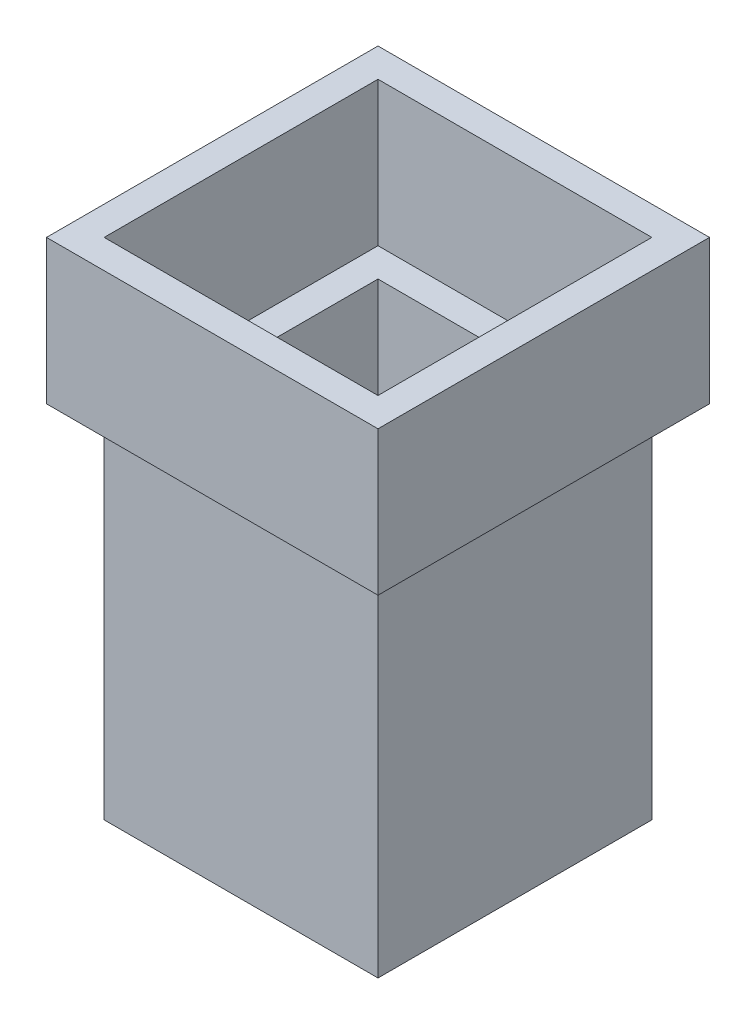
ISO-10303-21;
HEADER;
FILE_DESCRIPTION(('STEP AP214'),'2;1');
FILE_NAME('part.step','',(''),(''),'','','');
FILE_SCHEMA(('AUTOMOTIVE_DESIGN { 1 0 10303 214 1 1 1 1 }'));
ENDSEC;
DATA;
#1=APPLICATION_CONTEXT('core data for automotive mechanical design processes');
#2=APPLICATION_PROTOCOL_DEFINITION('international standard','automotive_design',2000,#1);
#3=PRODUCT_CONTEXT('',#1,'mechanical');
#4=PRODUCT('Part','Part','',(#3));
#5=PRODUCT_RELATED_PRODUCT_CATEGORY('part','',(#4));
#6=PRODUCT_DEFINITION_FORMATION('','',#4);
#7=PRODUCT_DEFINITION_CONTEXT('part definition',#1,'design');
#8=PRODUCT_DEFINITION('design','',#6,#7);
#9=PRODUCT_DEFINITION_SHAPE('','',#8);
#10=(LENGTH_UNIT() NAMED_UNIT(*) SI_UNIT(.MILLI.,.METRE.));
#11=(NAMED_UNIT(*) PLANE_ANGLE_UNIT() SI_UNIT($,.RADIAN.));
#12=(NAMED_UNIT(*) SI_UNIT($,.STERADIAN.) SOLID_ANGLE_UNIT());
#13=UNCERTAINTY_MEASURE_WITH_UNIT(LENGTH_MEASURE(1.E-05),#10,'distance_accuracy_value','');
#14=(GEOMETRIC_REPRESENTATION_CONTEXT(3) GLOBAL_UNCERTAINTY_ASSIGNED_CONTEXT((#13)) GLOBAL_UNIT_ASSIGNED_CONTEXT((#10,
#11,#12)) REPRESENTATION_CONTEXT('',''));
#15=CARTESIAN_POINT('',(0.,0.,0.));
#16=DIRECTION('',(0.,0.,1.));
#17=DIRECTION('',(1.,0.,0.));
#18=AXIS2_PLACEMENT_3D('',#15,#16,#17);
#19=CARTESIAN_POINT('',(0.,35.,0.));
#20=DIRECTION('',(0.,-1.,0.));
#21=DIRECTION('',(0.,0.,-1.));
#22=AXIS2_PLACEMENT_3D('',#19,#20,#21);
#23=PLANE('',#22);
#24=DIRECTION('',(0.,0.,1.));
#25=VECTOR('',#24,1.);
#26=CARTESIAN_POINT('',(-11.5,35.,-11.5));
#27=LINE('',#26,#25);
#28=CARTESIAN_POINT('',(-11.5,35.,-11.5));
#29=VERTEX_POINT('',#28);
#30=CARTESIAN_POINT('',(-11.5,35.,11.5));
#31=VERTEX_POINT('',#30);
#32=EDGE_CURVE('E150',#29,#31,#27,.T.);
#33=ORIENTED_EDGE('',*,*,#32,.T.);
#34=DIRECTION('',(1.,0.,0.));
#35=VECTOR('',#34,1.);
#36=CARTESIAN_POINT('',(11.5,35.,11.5));
#37=LINE('',#36,#35);
#38=CARTESIAN_POINT('',(11.5,35.,11.5));
#39=VERTEX_POINT('',#38);
#40=EDGE_CURVE('E153',#31,#39,#37,.T.);
#41=ORIENTED_EDGE('',*,*,#40,.T.);
#42=DIRECTION('',(0.,0.,-1.));
#43=VECTOR('',#42,1.);
#44=CARTESIAN_POINT('',(11.5,35.,-11.5));
#45=LINE('',#44,#43);
#46=CARTESIAN_POINT('',(11.5,35.,-11.5));
#47=VERTEX_POINT('',#46);
#48=EDGE_CURVE('E156',#39,#47,#45,.T.);
#49=ORIENTED_EDGE('',*,*,#48,.T.);
#50=DIRECTION('',(-1.,0.,0.));
#51=VECTOR('',#50,1.);
#52=CARTESIAN_POINT('',(11.5,35.,-11.5));
#53=LINE('',#52,#51);
#54=EDGE_CURVE('E158',#47,#29,#53,.T.);
#55=ORIENTED_EDGE('',*,*,#54,.T.);
#56=EDGE_LOOP('',(#33,#41,#49,#55));
#57=FACE_BOUND('',#56,.T.);
#58=DIRECTION('',(0.,0.,1.));
#59=VECTOR('',#58,1.);
#60=CARTESIAN_POINT('',(-9.5,35.,-9.5));
#61=LINE('',#60,#59);
#62=CARTESIAN_POINT('',(-9.5,35.,-9.5));
#63=VERTEX_POINT('',#62);
#64=CARTESIAN_POINT('',(-9.5,35.,9.5));
#65=VERTEX_POINT('',#64);
#66=EDGE_CURVE('E114',#63,#65,#61,.T.);
#67=ORIENTED_EDGE('',*,*,#66,.F.);
#68=DIRECTION('',(-1.,0.,0.));
#69=VECTOR('',#68,1.);
#70=CARTESIAN_POINT('',(-9.5,35.,-9.5));
#71=LINE('',#70,#69);
#72=CARTESIAN_POINT('',(9.5,35.,-9.5));
#73=VERTEX_POINT('',#72);
#74=EDGE_CURVE('E136',#73,#63,#71,.T.);
#75=ORIENTED_EDGE('',*,*,#74,.F.);
#76=DIRECTION('',(0.,0.,-1.));
#77=VECTOR('',#76,1.);
#78=CARTESIAN_POINT('',(9.5,35.,-9.5));
#79=LINE('',#78,#77);
#80=CARTESIAN_POINT('',(9.5,35.,9.5));
#81=VERTEX_POINT('',#80);
#82=EDGE_CURVE('E134',#81,#73,#79,.T.);
#83=ORIENTED_EDGE('',*,*,#82,.F.);
#84=DIRECTION('',(1.,0.,0.));
#85=VECTOR('',#84,1.);
#86=CARTESIAN_POINT('',(-9.5,35.,9.5));
#87=LINE('',#86,#85);
#88=EDGE_CURVE('E122',#65,#81,#87,.T.);
#89=ORIENTED_EDGE('',*,*,#88,.F.);
#90=EDGE_LOOP('',(#67,#75,#83,#89));
#91=FACE_BOUND('',#90,.T.);
#92=ADVANCED_FACE('F49',(#57,#91),#23,.F.);
#93=CARTESIAN_POINT('',(0.,25.,0.));
#94=DIRECTION('',(0.,-1.,0.));
#95=DIRECTION('',(0.,0.,-1.));
#96=AXIS2_PLACEMENT_3D('',#93,#94,#95);
#97=PLANE('',#96);
#98=DIRECTION('',(0.,0.,1.));
#99=VECTOR('',#98,1.);
#100=CARTESIAN_POINT('',(-11.5,25.,-11.5));
#101=LINE('',#100,#99);
#102=CARTESIAN_POINT('',(-11.5,25.,-11.5));
#103=VERTEX_POINT('',#102);
#104=CARTESIAN_POINT('',(-11.5,25.,11.5));
#105=VERTEX_POINT('',#104);
#106=EDGE_CURVE('E130',#103,#105,#101,.T.);
#107=ORIENTED_EDGE('',*,*,#106,.F.);
#108=DIRECTION('',(-1.,0.,0.));
#109=VECTOR('',#108,1.);
#110=CARTESIAN_POINT('',(11.5,25.,-11.5));
#111=LINE('',#110,#109);
#112=CARTESIAN_POINT('',(11.5,25.,-11.5));
#113=VERTEX_POINT('',#112);
#114=EDGE_CURVE('E154',#113,#103,#111,.T.);
#115=ORIENTED_EDGE('',*,*,#114,.F.);
#116=DIRECTION('',(0.,0.,-1.));
#117=VECTOR('',#116,1.);
#118=CARTESIAN_POINT('',(11.5,25.,-11.5));
#119=LINE('',#118,#117);
#120=CARTESIAN_POINT('',(11.5,25.,11.5));
#121=VERTEX_POINT('',#120);
#122=EDGE_CURVE('E165',#121,#113,#119,.T.);
#123=ORIENTED_EDGE('',*,*,#122,.F.);
#124=DIRECTION('',(1.,0.,0.));
#125=VECTOR('',#124,1.);
#126=CARTESIAN_POINT('',(11.5,25.,11.5));
#127=LINE('',#126,#125);
#128=EDGE_CURVE('E163',#105,#121,#127,.T.);
#129=ORIENTED_EDGE('',*,*,#128,.F.);
#130=EDGE_LOOP('',(#107,#115,#123,#129));
#131=FACE_BOUND('',#130,.T.);
#132=DIRECTION('',(-1.,0.,0.));
#133=VECTOR('',#132,1.);
#134=CARTESIAN_POINT('',(-9.5,25.,-9.5));
#135=LINE('',#134,#133);
#136=CARTESIAN_POINT('',(9.5,25.,-9.5));
#137=VERTEX_POINT('',#136);
#138=CARTESIAN_POINT('',(-9.5,25.,-9.5));
#139=VERTEX_POINT('',#138);
#140=EDGE_CURVE('E123',#137,#139,#135,.T.);
#141=ORIENTED_EDGE('',*,*,#140,.T.);
#142=DIRECTION('',(0.,0.,1.));
#143=VECTOR('',#142,1.);
#144=CARTESIAN_POINT('',(-9.5,25.,-9.5));
#145=LINE('',#144,#143);
#146=CARTESIAN_POINT('',(-9.5,25.,9.5));
#147=VERTEX_POINT('',#146);
#148=EDGE_CURVE('E72',#139,#147,#145,.T.);
#149=ORIENTED_EDGE('',*,*,#148,.T.);
#150=DIRECTION('',(1.,0.,0.));
#151=VECTOR('',#150,1.);
#152=CARTESIAN_POINT('',(-9.5,25.,9.5));
#153=LINE('',#152,#151);
#154=CARTESIAN_POINT('',(9.5,25.,9.5));
#155=VERTEX_POINT('',#154);
#156=EDGE_CURVE('E129',#147,#155,#153,.T.);
#157=ORIENTED_EDGE('',*,*,#156,.T.);
#158=DIRECTION('',(0.,0.,-1.));
#159=VECTOR('',#158,1.);
#160=CARTESIAN_POINT('',(9.5,25.,-9.5));
#161=LINE('',#160,#159);
#162=EDGE_CURVE('E142',#155,#137,#161,.T.);
#163=ORIENTED_EDGE('',*,*,#162,.T.);
#164=EDGE_LOOP('',(#141,#149,#157,#163));
#165=FACE_BOUND('',#164,.T.);
#166=ADVANCED_FACE('F183',(#131,#165),#97,.T.);
#167=CARTESIAN_POINT('',(-11.5,35.,-11.5));
#168=DIRECTION('',(1.,0.,0.));
#169=DIRECTION('',(0.,0.,-1.));
#170=AXIS2_PLACEMENT_3D('',#167,#168,#169);
#171=PLANE('',#170);
#172=ORIENTED_EDGE('',*,*,#106,.T.);
#173=DIRECTION('',(0.,-1.,0.));
#174=VECTOR('',#173,1.);
#175=CARTESIAN_POINT('',(-11.5,35.,11.5));
#176=LINE('',#175,#174);
#177=EDGE_CURVE('E12',#31,#105,#176,.T.);
#178=ORIENTED_EDGE('',*,*,#177,.F.);
#179=ORIENTED_EDGE('',*,*,#32,.F.);
#180=DIRECTION('',(0.,-1.,0.));
#181=VECTOR('',#180,1.);
#182=CARTESIAN_POINT('',(-11.5,35.,-11.5));
#183=LINE('',#182,#181);
#184=EDGE_CURVE('E160',#29,#103,#183,.T.);
#185=ORIENTED_EDGE('',*,*,#184,.T.);
#186=EDGE_LOOP('',(#172,#178,#179,#185));
#187=FACE_BOUND('',#186,.T.);
#188=ADVANCED_FACE('F51',(#187),#171,.F.);
#189=CARTESIAN_POINT('',(11.5,35.,11.5));
#190=DIRECTION('',(0.,0.,-1.));
#191=DIRECTION('',(-1.,0.,0.));
#192=AXIS2_PLACEMENT_3D('',#189,#190,#191);
#193=PLANE('',#192);
#194=ORIENTED_EDGE('',*,*,#128,.T.);
#195=DIRECTION('',(0.,-1.,0.));
#196=VECTOR('',#195,1.);
#197=CARTESIAN_POINT('',(11.5,35.,11.5));
#198=LINE('',#197,#196);
#199=EDGE_CURVE('E57',#39,#121,#198,.T.);
#200=ORIENTED_EDGE('',*,*,#199,.F.);
#201=ORIENTED_EDGE('',*,*,#40,.F.);
#202=ORIENTED_EDGE('',*,*,#177,.T.);
#203=EDGE_LOOP('',(#194,#200,#201,#202));
#204=FACE_BOUND('',#203,.T.);
#205=ADVANCED_FACE('F193',(#204),#193,.F.);
#206=CARTESIAN_POINT('',(11.5,35.,-11.5));
#207=DIRECTION('',(-1.,0.,0.));
#208=DIRECTION('',(0.,0.,1.));
#209=AXIS2_PLACEMENT_3D('',#206,#207,#208);
#210=PLANE('',#209);
#211=ORIENTED_EDGE('',*,*,#122,.T.);
#212=DIRECTION('',(0.,-1.,0.));
#213=VECTOR('',#212,1.);
#214=CARTESIAN_POINT('',(11.5,35.,-11.5));
#215=LINE('',#214,#213);
#216=EDGE_CURVE('E170',#47,#113,#215,.T.);
#217=ORIENTED_EDGE('',*,*,#216,.F.);
#218=ORIENTED_EDGE('',*,*,#48,.F.);
#219=ORIENTED_EDGE('',*,*,#199,.T.);
#220=EDGE_LOOP('',(#211,#217,#218,#219));
#221=FACE_BOUND('',#220,.T.);
#222=ADVANCED_FACE('F177',(#221),#210,.F.);
#223=CARTESIAN_POINT('',(11.5,35.,-11.5));
#224=DIRECTION('',(0.,0.,1.));
#225=DIRECTION('',(1.,0.,0.));
#226=AXIS2_PLACEMENT_3D('',#223,#224,#225);
#227=PLANE('',#226);
#228=ORIENTED_EDGE('',*,*,#114,.T.);
#229=ORIENTED_EDGE('',*,*,#184,.F.);
#230=ORIENTED_EDGE('',*,*,#54,.F.);
#231=ORIENTED_EDGE('',*,*,#216,.T.);
#232=EDGE_LOOP('',(#228,#229,#230,#231));
#233=FACE_BOUND('',#232,.T.);
#234=ADVANCED_FACE('F187',(#233),#227,.F.);
#235=CARTESIAN_POINT('',(-9.5,35.,-9.5));
#236=DIRECTION('',(1.,0.,0.));
#237=DIRECTION('',(0.,0.,-1.));
#238=AXIS2_PLACEMENT_3D('',#235,#236,#237);
#239=PLANE('',#238);
#240=ORIENTED_EDGE('',*,*,#148,.F.);
#241=DIRECTION('',(0.,-1.,0.));
#242=VECTOR('',#241,1.);
#243=CARTESIAN_POINT('',(-9.5,35.,-9.5));
#244=LINE('',#243,#242);
#245=EDGE_CURVE('E118',#63,#139,#244,.T.);
#246=ORIENTED_EDGE('',*,*,#245,.F.);
#247=ORIENTED_EDGE('',*,*,#66,.T.);
#248=DIRECTION('',(0.,-1.,0.));
#249=VECTOR('',#248,1.);
#250=CARTESIAN_POINT('',(-9.5,35.,9.5));
#251=LINE('',#250,#249);
#252=EDGE_CURVE('E117',#65,#147,#251,.T.);
#253=ORIENTED_EDGE('',*,*,#252,.T.);
#254=EDGE_LOOP('',(#240,#246,#247,#253));
#255=FACE_BOUND('',#254,.T.);
#256=ADVANCED_FACE('F116',(#255),#239,.T.);
#257=CARTESIAN_POINT('',(-9.5,35.,9.5));
#258=DIRECTION('',(0.,0.,-1.));
#259=DIRECTION('',(-1.,0.,0.));
#260=AXIS2_PLACEMENT_3D('',#257,#258,#259);
#261=PLANE('',#260);
#262=ORIENTED_EDGE('',*,*,#156,.F.);
#263=ORIENTED_EDGE('',*,*,#252,.F.);
#264=ORIENTED_EDGE('',*,*,#88,.T.);
#265=DIRECTION('',(0.,-1.,0.));
#266=VECTOR('',#265,1.);
#267=CARTESIAN_POINT('',(9.5,35.,9.5));
#268=LINE('',#267,#266);
#269=EDGE_CURVE('E131',#81,#155,#268,.T.);
#270=ORIENTED_EDGE('',*,*,#269,.T.);
#271=EDGE_LOOP('',(#262,#263,#264,#270));
#272=FACE_BOUND('',#271,.T.);
#273=ADVANCED_FACE('F126',(#272),#261,.T.);
#274=CARTESIAN_POINT('',(9.5,35.,-9.5));
#275=DIRECTION('',(-1.,0.,0.));
#276=DIRECTION('',(0.,0.,1.));
#277=AXIS2_PLACEMENT_3D('',#274,#275,#276);
#278=PLANE('',#277);
#279=ORIENTED_EDGE('',*,*,#162,.F.);
#280=ORIENTED_EDGE('',*,*,#269,.F.);
#281=ORIENTED_EDGE('',*,*,#82,.T.);
#282=DIRECTION('',(0.,-1.,0.));
#283=VECTOR('',#282,1.);
#284=CARTESIAN_POINT('',(9.5,35.,-9.5));
#285=LINE('',#284,#283);
#286=EDGE_CURVE('E64',#73,#137,#285,.T.);
#287=ORIENTED_EDGE('',*,*,#286,.T.);
#288=EDGE_LOOP('',(#279,#280,#281,#287));
#289=FACE_BOUND('',#288,.T.);
#290=ADVANCED_FACE('F216',(#289),#278,.T.);
#291=CARTESIAN_POINT('',(-9.5,35.,-9.5));
#292=DIRECTION('',(0.,0.,1.));
#293=DIRECTION('',(1.,0.,0.));
#294=AXIS2_PLACEMENT_3D('',#291,#292,#293);
#295=PLANE('',#294);
#296=ORIENTED_EDGE('',*,*,#140,.F.);
#297=ORIENTED_EDGE('',*,*,#286,.F.);
#298=ORIENTED_EDGE('',*,*,#74,.T.);
#299=ORIENTED_EDGE('',*,*,#245,.T.);
#300=EDGE_LOOP('',(#296,#297,#298,#299));
#301=FACE_BOUND('',#300,.T.);
#302=ADVANCED_FACE('F220',(#301),#295,.T.);
#303=CLOSED_SHELL('',(#92,#166,#188,#205,#222,#234,#256,#273,#290,#302));
#304=MANIFOLD_SOLID_BREP('B2',#303);
#305=CARTESIAN_POINT('',(0.,25.,0.));
#306=DIRECTION('',(0.,-1.,0.));
#307=DIRECTION('',(0.,0.,-1.));
#308=AXIS2_PLACEMENT_3D('',#305,#306,#307);
#309=PLANE('',#308);
#310=DIRECTION('',(0.,0.,1.));
#311=VECTOR('',#310,1.);
#312=CARTESIAN_POINT('',(-9.5,25.,-9.5));
#313=LINE('',#312,#311);
#314=CARTESIAN_POINT('',(-9.5,25.,-9.5));
#315=VERTEX_POINT('',#314);
#316=CARTESIAN_POINT('',(-9.5,25.,9.5));
#317=VERTEX_POINT('',#316);
#318=EDGE_CURVE('E400',#315,#317,#313,.T.);
#319=ORIENTED_EDGE('',*,*,#318,.T.);
#320=DIRECTION('',(1.,0.,0.));
#321=VECTOR('',#320,1.);
#322=CARTESIAN_POINT('',(9.5,25.,9.5));
#323=LINE('',#322,#321);
#324=CARTESIAN_POINT('',(9.5,25.,9.5));
#325=VERTEX_POINT('',#324);
#326=EDGE_CURVE('E403',#317,#325,#323,.T.);
#327=ORIENTED_EDGE('',*,*,#326,.T.);
#328=DIRECTION('',(0.,0.,-1.));
#329=VECTOR('',#328,1.);
#330=CARTESIAN_POINT('',(9.5,25.,-9.5));
#331=LINE('',#330,#329);
#332=CARTESIAN_POINT('',(9.5,25.,-9.5));
#333=VERTEX_POINT('',#332);
#334=EDGE_CURVE('E406',#325,#333,#331,.T.);
#335=ORIENTED_EDGE('',*,*,#334,.T.);
#336=DIRECTION('',(-1.,0.,0.));
#337=VECTOR('',#336,1.);
#338=CARTESIAN_POINT('',(9.5,25.,-9.5));
#339=LINE('',#338,#337);
#340=EDGE_CURVE('E408',#333,#315,#339,.T.);
#341=ORIENTED_EDGE('',*,*,#340,.T.);
#342=EDGE_LOOP('',(#319,#327,#335,#341));
#343=FACE_BOUND('',#342,.T.);
#344=DIRECTION('',(0.,0.,1.));
#345=VECTOR('',#344,1.);
#346=CARTESIAN_POINT('',(-7.5,25.,-7.5));
#347=LINE('',#346,#345);
#348=CARTESIAN_POINT('',(-7.5,25.,-7.5));
#349=VERTEX_POINT('',#348);
#350=CARTESIAN_POINT('',(-7.5,25.,7.5));
#351=VERTEX_POINT('',#350);
#352=EDGE_CURVE('E364',#349,#351,#347,.T.);
#353=ORIENTED_EDGE('',*,*,#352,.F.);
#354=DIRECTION('',(-1.,0.,0.));
#355=VECTOR('',#354,1.);
#356=CARTESIAN_POINT('',(7.5,25.,-7.5));
#357=LINE('',#356,#355);
#358=CARTESIAN_POINT('',(7.5,25.,-7.5));
#359=VERTEX_POINT('',#358);
#360=EDGE_CURVE('E386',#359,#349,#357,.T.);
#361=ORIENTED_EDGE('',*,*,#360,.F.);
#362=DIRECTION('',(0.,0.,-1.));
#363=VECTOR('',#362,1.);
#364=CARTESIAN_POINT('',(7.5,25.,-7.5));
#365=LINE('',#364,#363);
#366=CARTESIAN_POINT('',(7.5,25.,7.5));
#367=VERTEX_POINT('',#366);
#368=EDGE_CURVE('E384',#367,#359,#365,.T.);
#369=ORIENTED_EDGE('',*,*,#368,.F.);
#370=DIRECTION('',(1.,0.,0.));
#371=VECTOR('',#370,1.);
#372=CARTESIAN_POINT('',(7.5,25.,7.5));
#373=LINE('',#372,#371);
#374=EDGE_CURVE('E372',#351,#367,#373,.T.);
#375=ORIENTED_EDGE('',*,*,#374,.F.);
#376=EDGE_LOOP('',(#353,#361,#369,#375));
#377=FACE_BOUND('',#376,.T.);
#378=ADVANCED_FACE('F299',(#343,#377),#309,.F.);
#379=CARTESIAN_POINT('',(0.,0.,0.));
#380=DIRECTION('',(0.,-1.,0.));
#381=DIRECTION('',(0.,0.,-1.));
#382=AXIS2_PLACEMENT_3D('',#379,#380,#381);
#383=PLANE('',#382);
#384=DIRECTION('',(0.,0.,1.));
#385=VECTOR('',#384,1.);
#386=CARTESIAN_POINT('',(-9.5,0.,-9.5));
#387=LINE('',#386,#385);
#388=CARTESIAN_POINT('',(-9.5,0.,-9.5));
#389=VERTEX_POINT('',#388);
#390=CARTESIAN_POINT('',(-9.5,0.,9.5));
#391=VERTEX_POINT('',#390);
#392=EDGE_CURVE('E380',#389,#391,#387,.T.);
#393=ORIENTED_EDGE('',*,*,#392,.F.);
#394=DIRECTION('',(-1.,0.,0.));
#395=VECTOR('',#394,1.);
#396=CARTESIAN_POINT('',(9.5,0.,-9.5));
#397=LINE('',#396,#395);
#398=CARTESIAN_POINT('',(9.5,0.,-9.5));
#399=VERTEX_POINT('',#398);
#400=EDGE_CURVE('E404',#399,#389,#397,.T.);
#401=ORIENTED_EDGE('',*,*,#400,.F.);
#402=DIRECTION('',(0.,0.,-1.));
#403=VECTOR('',#402,1.);
#404=CARTESIAN_POINT('',(9.5,0.,-9.5));
#405=LINE('',#404,#403);
#406=CARTESIAN_POINT('',(9.5,0.,9.5));
#407=VERTEX_POINT('',#406);
#408=EDGE_CURVE('E415',#407,#399,#405,.T.);
#409=ORIENTED_EDGE('',*,*,#408,.F.);
#410=DIRECTION('',(1.,0.,0.));
#411=VECTOR('',#410,1.);
#412=CARTESIAN_POINT('',(9.5,0.,9.5));
#413=LINE('',#412,#411);
#414=EDGE_CURVE('E413',#391,#407,#413,.T.);
#415=ORIENTED_EDGE('',*,*,#414,.F.);
#416=EDGE_LOOP('',(#393,#401,#409,#415));
#417=FACE_BOUND('',#416,.T.);
#418=DIRECTION('',(-1.,0.,0.));
#419=VECTOR('',#418,1.);
#420=CARTESIAN_POINT('',(7.5,0.,-7.5));
#421=LINE('',#420,#419);
#422=CARTESIAN_POINT('',(7.5,0.,-7.5));
#423=VERTEX_POINT('',#422);
#424=CARTESIAN_POINT('',(-7.5,0.,-7.5));
#425=VERTEX_POINT('',#424);
#426=EDGE_CURVE('E373',#423,#425,#421,.T.);
#427=ORIENTED_EDGE('',*,*,#426,.T.);
#428=DIRECTION('',(0.,0.,1.));
#429=VECTOR('',#428,1.);
#430=CARTESIAN_POINT('',(-7.5,0.,-7.5));
#431=LINE('',#430,#429);
#432=CARTESIAN_POINT('',(-7.5,0.,7.5));
#433=VERTEX_POINT('',#432);
#434=EDGE_CURVE('E322',#425,#433,#431,.T.);
#435=ORIENTED_EDGE('',*,*,#434,.T.);
#436=DIRECTION('',(1.,0.,0.));
#437=VECTOR('',#436,1.);
#438=CARTESIAN_POINT('',(7.5,0.,7.5));
#439=LINE('',#438,#437);
#440=CARTESIAN_POINT('',(7.5,0.,7.5));
#441=VERTEX_POINT('',#440);
#442=EDGE_CURVE('E379',#433,#441,#439,.T.);
#443=ORIENTED_EDGE('',*,*,#442,.T.);
#444=DIRECTION('',(0.,0.,-1.));
#445=VECTOR('',#444,1.);
#446=CARTESIAN_POINT('',(7.5,0.,-7.5));
#447=LINE('',#446,#445);
#448=EDGE_CURVE('E392',#441,#423,#447,.T.);
#449=ORIENTED_EDGE('',*,*,#448,.T.);
#450=EDGE_LOOP('',(#427,#435,#443,#449));
#451=FACE_BOUND('',#450,.T.);
#452=ADVANCED_FACE('F433',(#417,#451),#383,.T.);
#453=CARTESIAN_POINT('',(-9.5,25.,-9.5));
#454=DIRECTION('',(1.,0.,0.));
#455=DIRECTION('',(0.,0.,-1.));
#456=AXIS2_PLACEMENT_3D('',#453,#454,#455);
#457=PLANE('',#456);
#458=ORIENTED_EDGE('',*,*,#392,.T.);
#459=DIRECTION('',(0.,-1.,0.));
#460=VECTOR('',#459,1.);
#461=CARTESIAN_POINT('',(-9.5,25.,9.5));
#462=LINE('',#461,#460);
#463=EDGE_CURVE('E47',#317,#391,#462,.T.);
#464=ORIENTED_EDGE('',*,*,#463,.F.);
#465=ORIENTED_EDGE('',*,*,#318,.F.);
#466=DIRECTION('',(0.,-1.,0.));
#467=VECTOR('',#466,1.);
#468=CARTESIAN_POINT('',(-9.5,25.,-9.5));
#469=LINE('',#468,#467);
#470=EDGE_CURVE('E410',#315,#389,#469,.T.);
#471=ORIENTED_EDGE('',*,*,#470,.T.);
#472=EDGE_LOOP('',(#458,#464,#465,#471));
#473=FACE_BOUND('',#472,.T.);
#474=ADVANCED_FACE('F301',(#473),#457,.F.);
#475=CARTESIAN_POINT('',(9.5,25.,9.5));
#476=DIRECTION('',(0.,0.,-1.));
#477=DIRECTION('',(-1.,0.,0.));
#478=AXIS2_PLACEMENT_3D('',#475,#476,#477);
#479=PLANE('',#478);
#480=ORIENTED_EDGE('',*,*,#414,.T.);
#481=DIRECTION('',(0.,-1.,0.));
#482=VECTOR('',#481,1.);
#483=CARTESIAN_POINT('',(9.5,25.,9.5));
#484=LINE('',#483,#482);
#485=EDGE_CURVE('E307',#325,#407,#484,.T.);
#486=ORIENTED_EDGE('',*,*,#485,.F.);
#487=ORIENTED_EDGE('',*,*,#326,.F.);
#488=ORIENTED_EDGE('',*,*,#463,.T.);
#489=EDGE_LOOP('',(#480,#486,#487,#488));
#490=FACE_BOUND('',#489,.T.);
#491=ADVANCED_FACE('F443',(#490),#479,.F.);
#492=CARTESIAN_POINT('',(9.5,25.,-9.5));
#493=DIRECTION('',(-1.,0.,0.));
#494=DIRECTION('',(0.,0.,1.));
#495=AXIS2_PLACEMENT_3D('',#492,#493,#494);
#496=PLANE('',#495);
#497=ORIENTED_EDGE('',*,*,#408,.T.);
#498=DIRECTION('',(0.,-1.,0.));
#499=VECTOR('',#498,1.);
#500=CARTESIAN_POINT('',(9.5,25.,-9.5));
#501=LINE('',#500,#499);
#502=EDGE_CURVE('E420',#333,#399,#501,.T.);
#503=ORIENTED_EDGE('',*,*,#502,.F.);
#504=ORIENTED_EDGE('',*,*,#334,.F.);
#505=ORIENTED_EDGE('',*,*,#485,.T.);
#506=EDGE_LOOP('',(#497,#503,#504,#505));
#507=FACE_BOUND('',#506,.T.);
#508=ADVANCED_FACE('F427',(#507),#496,.F.);
#509=CARTESIAN_POINT('',(9.5,25.,-9.5));
#510=DIRECTION('',(0.,0.,1.));
#511=DIRECTION('',(1.,0.,0.));
#512=AXIS2_PLACEMENT_3D('',#509,#510,#511);
#513=PLANE('',#512);
#514=ORIENTED_EDGE('',*,*,#400,.T.);
#515=ORIENTED_EDGE('',*,*,#470,.F.);
#516=ORIENTED_EDGE('',*,*,#340,.F.);
#517=ORIENTED_EDGE('',*,*,#502,.T.);
#518=EDGE_LOOP('',(#514,#515,#516,#517));
#519=FACE_BOUND('',#518,.T.);
#520=ADVANCED_FACE('F437',(#519),#513,.F.);
#521=CARTESIAN_POINT('',(-7.5,25.,-7.5));
#522=DIRECTION('',(1.,0.,0.));
#523=DIRECTION('',(0.,0.,-1.));
#524=AXIS2_PLACEMENT_3D('',#521,#522,#523);
#525=PLANE('',#524);
#526=ORIENTED_EDGE('',*,*,#434,.F.);
#527=DIRECTION('',(0.,-1.,0.));
#528=VECTOR('',#527,1.);
#529=CARTESIAN_POINT('',(-7.5,25.,-7.5));
#530=LINE('',#529,#528);
#531=EDGE_CURVE('E368',#349,#425,#530,.T.);
#532=ORIENTED_EDGE('',*,*,#531,.F.);
#533=ORIENTED_EDGE('',*,*,#352,.T.);
#534=DIRECTION('',(0.,-1.,0.));
#535=VECTOR('',#534,1.);
#536=CARTESIAN_POINT('',(-7.5,25.,7.5));
#537=LINE('',#536,#535);
#538=EDGE_CURVE('E367',#351,#433,#537,.T.);
#539=ORIENTED_EDGE('',*,*,#538,.T.);
#540=EDGE_LOOP('',(#526,#532,#533,#539));
#541=FACE_BOUND('',#540,.T.);
#542=ADVANCED_FACE('F366',(#541),#525,.T.);
#543=CARTESIAN_POINT('',(7.5,25.,7.5));
#544=DIRECTION('',(0.,0.,-1.));
#545=DIRECTION('',(-1.,0.,0.));
#546=AXIS2_PLACEMENT_3D('',#543,#544,#545);
#547=PLANE('',#546);
#548=ORIENTED_EDGE('',*,*,#442,.F.);
#549=ORIENTED_EDGE('',*,*,#538,.F.);
#550=ORIENTED_EDGE('',*,*,#374,.T.);
#551=DIRECTION('',(0.,-1.,0.));
#552=VECTOR('',#551,1.);
#553=CARTESIAN_POINT('',(7.5,25.,7.5));
#554=LINE('',#553,#552);
#555=EDGE_CURVE('E381',#367,#441,#554,.T.);
#556=ORIENTED_EDGE('',*,*,#555,.T.);
#557=EDGE_LOOP('',(#548,#549,#550,#556));
#558=FACE_BOUND('',#557,.T.);
#559=ADVANCED_FACE('F376',(#558),#547,.T.);
#560=CARTESIAN_POINT('',(7.5,25.,-7.5));
#561=DIRECTION('',(-1.,0.,0.));
#562=DIRECTION('',(0.,0.,1.));
#563=AXIS2_PLACEMENT_3D('',#560,#561,#562);
#564=PLANE('',#563);
#565=ORIENTED_EDGE('',*,*,#448,.F.);
#566=ORIENTED_EDGE('',*,*,#555,.F.);
#567=ORIENTED_EDGE('',*,*,#368,.T.);
#568=DIRECTION('',(0.,-1.,0.));
#569=VECTOR('',#568,1.);
#570=CARTESIAN_POINT('',(7.5,25.,-7.5));
#571=LINE('',#570,#569);
#572=EDGE_CURVE('E314',#359,#423,#571,.T.);
#573=ORIENTED_EDGE('',*,*,#572,.T.);
#574=EDGE_LOOP('',(#565,#566,#567,#573));
#575=FACE_BOUND('',#574,.T.);
#576=ADVANCED_FACE('F466',(#575),#564,.T.);
#577=CARTESIAN_POINT('',(7.5,25.,-7.5));
#578=DIRECTION('',(0.,0.,1.));
#579=DIRECTION('',(1.,0.,0.));
#580=AXIS2_PLACEMENT_3D('',#577,#578,#579);
#581=PLANE('',#580);
#582=ORIENTED_EDGE('',*,*,#426,.F.);
#583=ORIENTED_EDGE('',*,*,#572,.F.);
#584=ORIENTED_EDGE('',*,*,#360,.T.);
#585=ORIENTED_EDGE('',*,*,#531,.T.);
#586=EDGE_LOOP('',(#582,#583,#584,#585));
#587=FACE_BOUND('',#586,.T.);
#588=ADVANCED_FACE('F470',(#587),#581,.T.);
#589=CLOSED_SHELL('',(#378,#452,#474,#491,#508,#520,#542,#559,#576,#588));
#590=MANIFOLD_SOLID_BREP('B6',#589);
#591=ADVANCED_BREP_SHAPE_REPRESENTATION('',(#18,#304,#590),#14);
#592=SHAPE_DEFINITION_REPRESENTATION(#9,#591);
ENDSEC;
END-ISO-10303-21;
